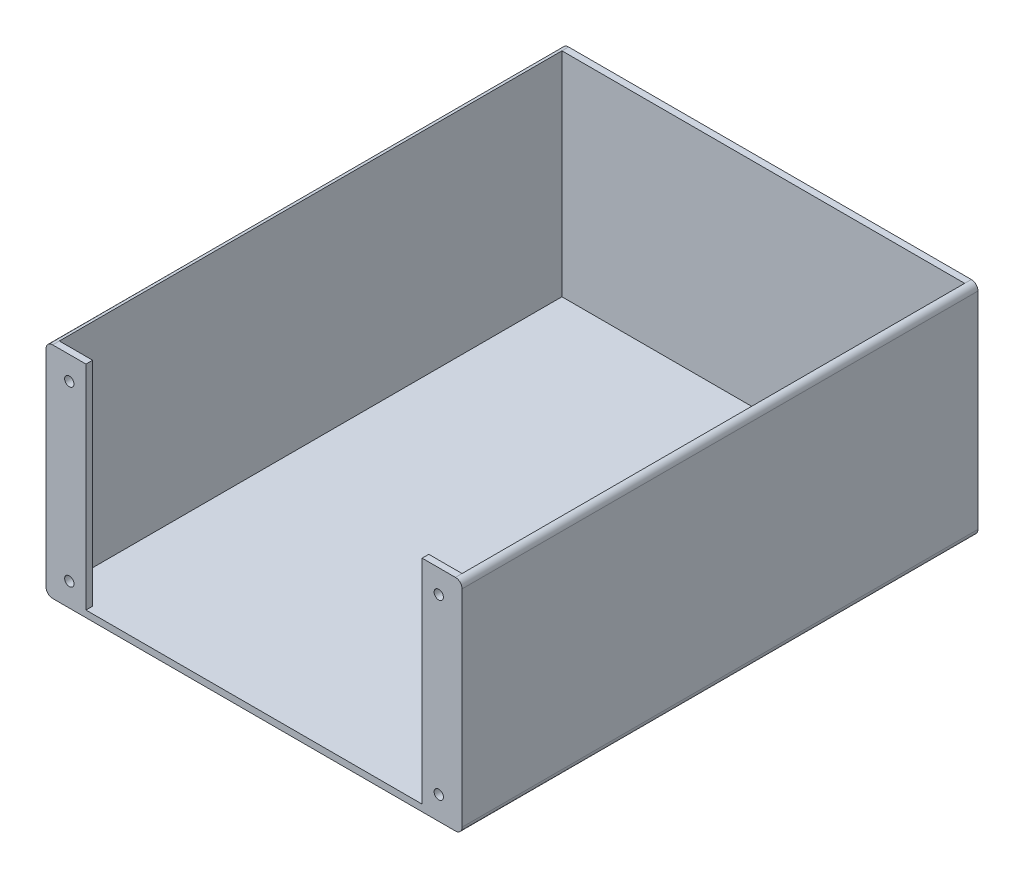
ISO-10303-21;
HEADER;
FILE_DESCRIPTION(('STEP AP214'),'2;1');
FILE_NAME('part.step','',(''),(''),'','','');
FILE_SCHEMA(('AUTOMOTIVE_DESIGN { 1 0 10303 214 1 1 1 1 }'));
ENDSEC;
DATA;
#1=APPLICATION_CONTEXT('core data for automotive mechanical design processes');
#2=APPLICATION_PROTOCOL_DEFINITION('international standard','automotive_design',2000,#1);
#3=PRODUCT_CONTEXT('',#1,'mechanical');
#4=PRODUCT('Part','Part','',(#3));
#5=PRODUCT_RELATED_PRODUCT_CATEGORY('part','',(#4));
#6=PRODUCT_DEFINITION_FORMATION('','',#4);
#7=PRODUCT_DEFINITION_CONTEXT('part definition',#1,'design');
#8=PRODUCT_DEFINITION('design','',#6,#7);
#9=PRODUCT_DEFINITION_SHAPE('','',#8);
#10=(LENGTH_UNIT() NAMED_UNIT(*) SI_UNIT(.MILLI.,.METRE.));
#11=(NAMED_UNIT(*) PLANE_ANGLE_UNIT() SI_UNIT($,.RADIAN.));
#12=(NAMED_UNIT(*) SI_UNIT($,.STERADIAN.) SOLID_ANGLE_UNIT());
#13=UNCERTAINTY_MEASURE_WITH_UNIT(LENGTH_MEASURE(1.E-05),#10,'distance_accuracy_value','');
#14=(GEOMETRIC_REPRESENTATION_CONTEXT(3) GLOBAL_UNCERTAINTY_ASSIGNED_CONTEXT((#13)) GLOBAL_UNIT_ASSIGNED_CONTEXT((#10,
#11,#12)) REPRESENTATION_CONTEXT('',''));
#15=CARTESIAN_POINT('',(0.,0.,0.));
#16=DIRECTION('',(0.,0.,1.));
#17=DIRECTION('',(1.,0.,0.));
#18=AXIS2_PLACEMENT_3D('',#15,#16,#17);
#19=CARTESIAN_POINT('',(-82.0163890560179,52.4090808351323,155.));
#20=DIRECTION('',(0.,-1.,0.));
#21=DIRECTION('',(0.,0.,-1.));
#22=AXIS2_PLACEMENT_3D('',#19,#20,#21);
#23=PLANE('',#22);
#24=DIRECTION('',(-1.,0.,0.));
#25=VECTOR('',#24,1.);
#26=CARTESIAN_POINT('',(-82.0163890560179,52.4090808351323,155.));
#27=LINE('',#26,#25);
#28=CARTESIAN_POINT('',(-70.0163890560179,52.4090808351323,155.));
#29=VERTEX_POINT('',#28);
#30=CARTESIAN_POINT('',(-80.0163890560179,52.4090808351323,155.));
#31=VERTEX_POINT('',#30);
#32=EDGE_CURVE('E289',#29,#31,#27,.T.);
#33=ORIENTED_EDGE('',*,*,#32,.F.);
#34=DIRECTION('',(0.,0.,-1.));
#35=VECTOR('',#34,1.);
#36=CARTESIAN_POINT('',(-70.0163890560179,52.4090808351323,155.));
#37=LINE('',#36,#35);
#38=CARTESIAN_POINT('',(-70.0163890560179,52.4090808351323,153.));
#39=VERTEX_POINT('',#38);
#40=EDGE_CURVE('E177',#29,#39,#37,.T.);
#41=ORIENTED_EDGE('',*,*,#40,.T.);
#42=DIRECTION('',(1.,0.,0.));
#43=VECTOR('',#42,1.);
#44=CARTESIAN_POINT('',(-80.0163890560179,52.4090808351323,153.));
#45=LINE('',#44,#43);
#46=CARTESIAN_POINT('',(-80.0163890560179,52.4090808351323,153.));
#47=VERTEX_POINT('',#46);
#48=EDGE_CURVE('E225',#47,#39,#45,.T.);
#49=ORIENTED_EDGE('',*,*,#48,.F.);
#50=DIRECTION('',(0.,0.,-1.));
#51=VECTOR('',#50,1.);
#52=CARTESIAN_POINT('',(-80.0163890560179,52.4090808351323,155.));
#53=LINE('',#52,#51);
#54=EDGE_CURVE('E345',#47,#31,#53,.F.);
#55=ORIENTED_EDGE('',*,*,#54,.T.);
#56=EDGE_LOOP('',(#33,#41,#49,#55));
#57=FACE_BOUND('',#56,.T.);
#58=ADVANCED_FACE('F47',(#57),#23,.F.);
#59=CARTESIAN_POINT('',(-80.0163890560179,-11.5909191648677,153.));
#60=DIRECTION('',(0.,0.,1.));
#61=DIRECTION('',(1.,0.,0.));
#62=AXIS2_PLACEMENT_3D('',#59,#60,#61);
#63=PLANE('',#62);
#64=CARTESIAN_POINT('',(-75.0163890560179,45.4090808351323,153.));
#65=DIRECTION('',(0.,0.,1.));
#66=DIRECTION('',(1.,0.,0.));
#67=AXIS2_PLACEMENT_3D('',#64,#65,#66);
#68=CIRCLE('',#67,1.4);
#69=CARTESIAN_POINT('',(-73.6163890560179,45.4090808351323,153.));
#70=VERTEX_POINT('',#69);
#71=EDGE_CURVE('E255',#70,#70,#68,.F.);
#72=ORIENTED_EDGE('',*,*,#71,.F.);
#73=EDGE_LOOP('',(#72));
#74=FACE_BOUND('',#73,.T.);
#75=CARTESIAN_POINT('',(-75.0163890560179,-6.59091916486775,153.));
#76=DIRECTION('',(0.,0.,1.));
#77=DIRECTION('',(1.,0.,0.));
#78=AXIS2_PLACEMENT_3D('',#75,#76,#77);
#79=CIRCLE('',#78,1.4);
#80=CARTESIAN_POINT('',(-73.6163890560179,-6.59091916486775,153.));
#81=VERTEX_POINT('',#80);
#82=EDGE_CURVE('E251',#81,#81,#79,.F.);
#83=ORIENTED_EDGE('',*,*,#82,.F.);
#84=EDGE_LOOP('',(#83));
#85=FACE_BOUND('',#84,.T.);
#86=ORIENTED_EDGE('',*,*,#48,.T.);
#87=DIRECTION('',(0.,-1.,0.));
#88=VECTOR('',#87,1.);
#89=CARTESIAN_POINT('',(-70.0163890560179,-11.5909191648677,153.));
#90=LINE('',#89,#88);
#91=CARTESIAN_POINT('',(-70.0163890560179,-11.5909191648677,153.));
#92=VERTEX_POINT('',#91);
#93=EDGE_CURVE('E200',#39,#92,#90,.T.);
#94=ORIENTED_EDGE('',*,*,#93,.T.);
#95=DIRECTION('',(1.,0.,0.));
#96=VECTOR('',#95,1.);
#97=CARTESIAN_POINT('',(-80.0163890560179,-11.5909191648677,153.));
#98=LINE('',#97,#96);
#99=CARTESIAN_POINT('',(-80.0163890560179,-11.5909191648677,153.));
#100=VERTEX_POINT('',#99);
#101=EDGE_CURVE('E167',#100,#92,#98,.T.);
#102=ORIENTED_EDGE('',*,*,#101,.F.);
#103=DIRECTION('',(0.,1.,0.));
#104=VECTOR('',#103,1.);
#105=CARTESIAN_POINT('',(-80.0163890560179,-11.5909191648677,153.));
#106=LINE('',#105,#104);
#107=EDGE_CURVE('E220',#100,#47,#106,.T.);
#108=ORIENTED_EDGE('',*,*,#107,.T.);
#109=EDGE_LOOP('',(#86,#94,#102,#108));
#110=FACE_BOUND('',#109,.T.);
#111=ADVANCED_FACE('F413',(#74,#85,#110),#63,.F.);
#112=CARTESIAN_POINT('',(-80.0163890560179,52.4090808351323,0.));
#113=VERTEX_POINT('',#112);
#114=CARTESIAN_POINT('',(-80.0163890560179,52.4090808351323,2.));
#115=VERTEX_POINT('',#114);
#116=EDGE_CURVE('E346',#113,#115,#53,.F.);
#117=ORIENTED_EDGE('',*,*,#116,.T.);
#118=DIRECTION('',(-1.,0.,0.));
#119=VECTOR('',#118,1.);
#120=CARTESIAN_POINT('',(-80.0163890560179,52.4090808351323,2.));
#121=LINE('',#120,#119);
#122=CARTESIAN_POINT('',(40.9836109439821,52.4090808351323,2.));
#123=VERTEX_POINT('',#122);
#124=EDGE_CURVE('E72',#123,#115,#121,.T.);
#125=ORIENTED_EDGE('',*,*,#124,.F.);
#126=DIRECTION('',(0.,0.,-1.));
#127=VECTOR('',#126,1.);
#128=CARTESIAN_POINT('',(40.9836109439821,52.4090808351323,155.));
#129=LINE('',#128,#127);
#130=CARTESIAN_POINT('',(40.9836109439821,52.4090808351323,0.));
#131=VERTEX_POINT('',#130);
#132=EDGE_CURVE('E350',#123,#131,#129,.T.);
#133=ORIENTED_EDGE('',*,*,#132,.T.);
#134=DIRECTION('',(-1.,0.,0.));
#135=VECTOR('',#134,1.);
#136=CARTESIAN_POINT('',(-82.0163890560179,52.4090808351323,0.));
#137=LINE('',#136,#135);
#138=EDGE_CURVE('E281',#131,#113,#137,.T.);
#139=ORIENTED_EDGE('',*,*,#138,.T.);
#140=EDGE_LOOP('',(#117,#125,#133,#139));
#141=FACE_BOUND('',#140,.T.);
#142=ADVANCED_FACE('F402',(#141),#23,.F.);
#143=CARTESIAN_POINT('',(-82.0163890560179,52.4090808351323,155.));
#144=DIRECTION('',(1.,0.,0.));
#145=DIRECTION('',(0.,1.,0.));
#146=AXIS2_PLACEMENT_3D('',#143,#144,#145);
#147=PLANE('',#146);
#148=DIRECTION('',(0.,-1.,0.));
#149=VECTOR('',#148,1.);
#150=CARTESIAN_POINT('',(-82.0163890560179,52.4090808351323,0.));
#151=LINE('',#150,#149);
#152=CARTESIAN_POINT('',(-82.0163890560179,50.4090808351323,0.));
#153=VERTEX_POINT('',#152);
#154=CARTESIAN_POINT('',(-82.0163890560179,-11.5909191648677,0.));
#155=VERTEX_POINT('',#154);
#156=EDGE_CURVE('E275',#153,#155,#151,.T.);
#157=ORIENTED_EDGE('',*,*,#156,.T.);
#158=DIRECTION('',(0.,0.,-1.));
#159=VECTOR('',#158,1.);
#160=CARTESIAN_POINT('',(-82.0163890560179,-11.5909191648677,155.));
#161=LINE('',#160,#159);
#162=CARTESIAN_POINT('',(-82.0163890560179,-11.5909191648677,155.));
#163=VERTEX_POINT('',#162);
#164=EDGE_CURVE('E11',#155,#163,#161,.F.);
#165=ORIENTED_EDGE('',*,*,#164,.T.);
#166=DIRECTION('',(0.,-1.,0.));
#167=VECTOR('',#166,1.);
#168=CARTESIAN_POINT('',(-82.0163890560179,52.4090808351323,155.));
#169=LINE('',#168,#167);
#170=CARTESIAN_POINT('',(-82.0163890560179,50.4090808351323,155.));
#171=VERTEX_POINT('',#170);
#172=EDGE_CURVE('E276',#171,#163,#169,.T.);
#173=ORIENTED_EDGE('',*,*,#172,.F.);
#174=DIRECTION('',(0.,0.,-1.));
#175=VECTOR('',#174,1.);
#176=CARTESIAN_POINT('',(-82.0163890560179,50.4090808351323,155.));
#177=LINE('',#176,#175);
#178=EDGE_CURVE('E57',#171,#153,#177,.T.);
#179=ORIENTED_EDGE('',*,*,#178,.T.);
#180=EDGE_LOOP('',(#157,#165,#173,#179));
#181=FACE_BOUND('',#180,.T.);
#182=ADVANCED_FACE('F361',(#181),#147,.F.);
#183=CARTESIAN_POINT('',(-82.0163890560179,-13.5909191648677,155.));
#184=DIRECTION('',(0.,1.,0.));
#185=DIRECTION('',(0.,0.,1.));
#186=AXIS2_PLACEMENT_3D('',#183,#184,#185);
#187=PLANE('',#186);
#188=DIRECTION('',(1.,0.,0.));
#189=VECTOR('',#188,1.);
#190=CARTESIAN_POINT('',(-82.0163890560179,-13.5909191648677,0.));
#191=LINE('',#190,#189);
#192=CARTESIAN_POINT('',(-80.0163890560179,-13.5909191648677,0.));
#193=VERTEX_POINT('',#192);
#194=CARTESIAN_POINT('',(40.9836109439821,-13.5909191648677,0.));
#195=VERTEX_POINT('',#194);
#196=EDGE_CURVE('E297',#193,#195,#191,.T.);
#197=ORIENTED_EDGE('',*,*,#196,.T.);
#198=DIRECTION('',(0.,0.,-1.));
#199=VECTOR('',#198,1.);
#200=CARTESIAN_POINT('',(40.9836109439821,-13.5909191648677,155.));
#201=LINE('',#200,#199);
#202=CARTESIAN_POINT('',(40.9836109439821,-13.5909191648677,155.));
#203=VERTEX_POINT('',#202);
#204=EDGE_CURVE('E330',#195,#203,#201,.F.);
#205=ORIENTED_EDGE('',*,*,#204,.T.);
#206=DIRECTION('',(1.,0.,0.));
#207=VECTOR('',#206,1.);
#208=CARTESIAN_POINT('',(-82.0163890560179,-13.5909191648677,155.));
#209=LINE('',#208,#207);
#210=CARTESIAN_POINT('',(-80.0163890560179,-13.5909191648677,155.));
#211=VERTEX_POINT('',#210);
#212=EDGE_CURVE('E280',#211,#203,#209,.T.);
#213=ORIENTED_EDGE('',*,*,#212,.F.);
#214=DIRECTION('',(0.,0.,-1.));
#215=VECTOR('',#214,1.);
#216=CARTESIAN_POINT('',(-80.0163890560179,-13.5909191648677,155.));
#217=LINE('',#216,#215);
#218=EDGE_CURVE('E326',#211,#193,#217,.T.);
#219=ORIENTED_EDGE('',*,*,#218,.T.);
#220=EDGE_LOOP('',(#197,#205,#213,#219));
#221=FACE_BOUND('',#220,.T.);
#222=ADVANCED_FACE('F376',(#221),#187,.F.);
#223=CARTESIAN_POINT('',(42.9836109439821,52.4090808351323,155.));
#224=DIRECTION('',(-1.,0.,0.));
#225=DIRECTION('',(0.,-1.,0.));
#226=AXIS2_PLACEMENT_3D('',#223,#224,#225);
#227=PLANE('',#226);
#228=DIRECTION('',(0.,1.,0.));
#229=VECTOR('',#228,1.);
#230=CARTESIAN_POINT('',(42.9836109439821,52.4090808351323,155.));
#231=LINE('',#230,#229);
#232=CARTESIAN_POINT('',(42.9836109439821,-11.5909191648677,155.));
#233=VERTEX_POINT('',#232);
#234=CARTESIAN_POINT('',(42.9836109439821,50.4090808351323,155.));
#235=VERTEX_POINT('',#234);
#236=EDGE_CURVE('E285',#233,#235,#231,.T.);
#237=ORIENTED_EDGE('',*,*,#236,.F.);
#238=DIRECTION('',(0.,0.,-1.));
#239=VECTOR('',#238,1.);
#240=CARTESIAN_POINT('',(42.9836109439821,-11.5909191648677,155.));
#241=LINE('',#240,#239);
#242=CARTESIAN_POINT('',(42.9836109439821,-11.5909191648677,0.));
#243=VERTEX_POINT('',#242);
#244=EDGE_CURVE('E310',#233,#243,#241,.T.);
#245=ORIENTED_EDGE('',*,*,#244,.T.);
#246=DIRECTION('',(0.,1.,0.));
#247=VECTOR('',#246,1.);
#248=CARTESIAN_POINT('',(42.9836109439821,52.4090808351323,0.));
#249=LINE('',#248,#247);
#250=CARTESIAN_POINT('',(42.9836109439821,50.4090808351323,0.));
#251=VERTEX_POINT('',#250);
#252=EDGE_CURVE('E301',#243,#251,#249,.T.);
#253=ORIENTED_EDGE('',*,*,#252,.T.);
#254=DIRECTION('',(0.,0.,-1.));
#255=VECTOR('',#254,1.);
#256=CARTESIAN_POINT('',(42.9836109439821,50.4090808351323,155.));
#257=LINE('',#256,#255);
#258=EDGE_CURVE('E293',#251,#235,#257,.F.);
#259=ORIENTED_EDGE('',*,*,#258,.T.);
#260=EDGE_LOOP('',(#237,#245,#253,#259));
#261=FACE_BOUND('',#260,.T.);
#262=ADVANCED_FACE('F384',(#261),#227,.F.);
#263=CARTESIAN_POINT('',(30.9836109439821,52.4090808351323,153.));
#264=VERTEX_POINT('',#263);
#265=CARTESIAN_POINT('',(40.9836109439821,52.4090808351323,153.));
#266=VERTEX_POINT('',#265);
#267=EDGE_CURVE('E224',#264,#266,#45,.T.);
#268=ORIENTED_EDGE('',*,*,#267,.F.);
#269=DIRECTION('',(0.,0.,1.));
#270=VECTOR('',#269,1.);
#271=CARTESIAN_POINT('',(30.9836109439821,52.4090808351323,155.));
#272=LINE('',#271,#270);
#273=CARTESIAN_POINT('',(30.9836109439821,52.4090808351323,155.));
#274=VERTEX_POINT('',#273);
#275=EDGE_CURVE('E196',#264,#274,#272,.T.);
#276=ORIENTED_EDGE('',*,*,#275,.T.);
#277=CARTESIAN_POINT('',(40.9836109439821,52.4090808351323,155.));
#278=VERTEX_POINT('',#277);
#279=EDGE_CURVE('E290',#278,#274,#27,.T.);
#280=ORIENTED_EDGE('',*,*,#279,.F.);
#281=EDGE_CURVE('E351',#278,#266,#129,.T.);
#282=ORIENTED_EDGE('',*,*,#281,.T.);
#283=EDGE_LOOP('',(#268,#276,#280,#282));
#284=FACE_BOUND('',#283,.T.);
#285=ADVANCED_FACE('F396',(#284),#23,.F.);
#286=CARTESIAN_POINT('',(0.,0.,155.));
#287=DIRECTION('',(0.,0.,1.));
#288=DIRECTION('',(1.,0.,0.));
#289=AXIS2_PLACEMENT_3D('',#286,#287,#288);
#290=PLANE('',#289);
#291=DIRECTION('',(0.,-1.,0.));
#292=VECTOR('',#291,1.);
#293=CARTESIAN_POINT('',(-70.0163890560179,52.4404586301676,155.));
#294=LINE('',#293,#292);
#295=CARTESIAN_POINT('',(-70.0163890560179,-11.5909191648677,155.));
#296=VERTEX_POINT('',#295);
#297=EDGE_CURVE('E174',#29,#296,#294,.T.);
#298=ORIENTED_EDGE('',*,*,#297,.F.);
#299=ORIENTED_EDGE('',*,*,#32,.T.);
#300=CARTESIAN_POINT('',(-80.0163890560179,50.4090808351323,155.));
#301=DIRECTION('',(0.,0.,1.));
#302=DIRECTION('',(1.,0.,0.));
#303=AXIS2_PLACEMENT_3D('',#300,#301,#302);
#304=CIRCLE('',#303,2.);
#305=EDGE_CURVE('E333',#31,#171,#304,.T.);
#306=ORIENTED_EDGE('',*,*,#305,.T.);
#307=ORIENTED_EDGE('',*,*,#172,.T.);
#308=CARTESIAN_POINT('',(-80.0163890560179,-11.5909191648677,155.));
#309=DIRECTION('',(0.,0.,1.));
#310=DIRECTION('',(1.,0.,0.));
#311=AXIS2_PLACEMENT_3D('',#308,#309,#310);
#312=CIRCLE('',#311,2.);
#313=EDGE_CURVE('E336',#163,#211,#312,.T.);
#314=ORIENTED_EDGE('',*,*,#313,.T.);
#315=ORIENTED_EDGE('',*,*,#212,.T.);
#316=CARTESIAN_POINT('',(40.9836109439821,-11.5909191648677,155.));
#317=DIRECTION('',(0.,0.,1.));
#318=DIRECTION('',(1.,0.,0.));
#319=AXIS2_PLACEMENT_3D('',#316,#317,#318);
#320=CIRCLE('',#319,2.);
#321=EDGE_CURVE('E342',#203,#233,#320,.T.);
#322=ORIENTED_EDGE('',*,*,#321,.T.);
#323=ORIENTED_EDGE('',*,*,#236,.T.);
#324=CARTESIAN_POINT('',(40.9836109439821,50.4090808351323,155.));
#325=DIRECTION('',(0.,0.,1.));
#326=DIRECTION('',(1.,0.,0.));
#327=AXIS2_PLACEMENT_3D('',#324,#325,#326);
#328=CIRCLE('',#327,2.);
#329=EDGE_CURVE('E339',#235,#278,#328,.T.);
#330=ORIENTED_EDGE('',*,*,#329,.T.);
#331=ORIENTED_EDGE('',*,*,#279,.T.);
#332=DIRECTION('',(0.,1.,0.));
#333=VECTOR('',#332,1.);
#334=CARTESIAN_POINT('',(30.9836109439821,52.4404586301676,155.));
#335=LINE('',#334,#333);
#336=CARTESIAN_POINT('',(30.9836109439821,-11.5909191648677,155.));
#337=VERTEX_POINT('',#336);
#338=EDGE_CURVE('E171',#337,#274,#335,.T.);
#339=ORIENTED_EDGE('',*,*,#338,.F.);
#340=DIRECTION('',(1.,0.,0.));
#341=VECTOR('',#340,1.);
#342=CARTESIAN_POINT('',(-70.0163890560179,-11.5909191648677,155.));
#343=LINE('',#342,#341);
#344=EDGE_CURVE('E163',#296,#337,#343,.T.);
#345=ORIENTED_EDGE('',*,*,#344,.F.);
#346=EDGE_LOOP('',(#298,#299,#306,#307,#314,#315,#322,#323,#330,#331,#339,#345));
#347=FACE_BOUND('',#346,.T.);
#348=CARTESIAN_POINT('',(35.9836109439821,45.4090808351323,155.));
#349=DIRECTION('',(0.,0.,1.));
#350=DIRECTION('',(1.,0.,0.));
#351=AXIS2_PLACEMENT_3D('',#348,#349,#350);
#352=CIRCLE('',#351,1.4);
#353=CARTESIAN_POINT('',(37.3836109439821,45.4090808351323,155.));
#354=VERTEX_POINT('',#353);
#355=EDGE_CURVE('E259',#354,#354,#352,.T.);
#356=ORIENTED_EDGE('',*,*,#355,.F.);
#357=EDGE_LOOP('',(#356));
#358=FACE_BOUND('',#357,.T.);
#359=CARTESIAN_POINT('',(35.9836109439821,-6.59091916486775,155.));
#360=DIRECTION('',(0.,0.,1.));
#361=DIRECTION('',(1.,0.,0.));
#362=AXIS2_PLACEMENT_3D('',#359,#360,#361);
#363=CIRCLE('',#362,1.4);
#364=CARTESIAN_POINT('',(37.3836109439821,-6.59091916486775,155.));
#365=VERTEX_POINT('',#364);
#366=EDGE_CURVE('E265',#365,#365,#363,.T.);
#367=ORIENTED_EDGE('',*,*,#366,.F.);
#368=EDGE_LOOP('',(#367));
#369=FACE_BOUND('',#368,.T.);
#370=CARTESIAN_POINT('',(-75.0163890560179,-6.59091916486775,155.));
#371=DIRECTION('',(0.,0.,1.));
#372=DIRECTION('',(1.,0.,0.));
#373=AXIS2_PLACEMENT_3D('',#370,#371,#372);
#374=CIRCLE('',#373,1.4);
#375=CARTESIAN_POINT('',(-73.6163890560179,-6.59091916486775,155.));
#376=VERTEX_POINT('',#375);
#377=EDGE_CURVE('E260',#376,#376,#374,.T.);
#378=ORIENTED_EDGE('',*,*,#377,.F.);
#379=EDGE_LOOP('',(#378));
#380=FACE_BOUND('',#379,.T.);
#381=CARTESIAN_POINT('',(-75.0163890560179,45.4090808351323,155.));
#382=DIRECTION('',(0.,0.,1.));
#383=DIRECTION('',(1.,0.,0.));
#384=AXIS2_PLACEMENT_3D('',#381,#382,#383);
#385=CIRCLE('',#384,1.4);
#386=CARTESIAN_POINT('',(-73.6163890560179,45.4090808351323,155.));
#387=VERTEX_POINT('',#386);
#388=EDGE_CURVE('E264',#387,#387,#385,.T.);
#389=ORIENTED_EDGE('',*,*,#388,.F.);
#390=EDGE_LOOP('',(#389));
#391=FACE_BOUND('',#390,.T.);
#392=ADVANCED_FACE('F182',(#347,#358,#369,#380,#391),#290,.T.);
#393=CARTESIAN_POINT('',(0.,0.,0.));
#394=DIRECTION('',(0.,0.,1.));
#395=DIRECTION('',(1.,0.,0.));
#396=AXIS2_PLACEMENT_3D('',#393,#394,#395);
#397=PLANE('',#396);
#398=ORIENTED_EDGE('',*,*,#252,.F.);
#399=CARTESIAN_POINT('',(40.9836109439821,-11.5909191648677,0.));
#400=DIRECTION('',(0.,0.,1.));
#401=DIRECTION('',(1.,0.,0.));
#402=AXIS2_PLACEMENT_3D('',#399,#400,#401);
#403=CIRCLE('',#402,2.);
#404=EDGE_CURVE('E323',#243,#195,#403,.F.);
#405=ORIENTED_EDGE('',*,*,#404,.T.);
#406=ORIENTED_EDGE('',*,*,#196,.F.);
#407=CARTESIAN_POINT('',(-80.0163890560179,-11.5909191648677,0.));
#408=DIRECTION('',(0.,0.,1.));
#409=DIRECTION('',(1.,0.,0.));
#410=AXIS2_PLACEMENT_3D('',#407,#408,#409);
#411=CIRCLE('',#410,2.);
#412=EDGE_CURVE('E317',#193,#155,#411,.F.);
#413=ORIENTED_EDGE('',*,*,#412,.T.);
#414=ORIENTED_EDGE('',*,*,#156,.F.);
#415=CARTESIAN_POINT('',(-80.0163890560179,50.4090808351323,0.));
#416=DIRECTION('',(0.,0.,1.));
#417=DIRECTION('',(1.,0.,0.));
#418=AXIS2_PLACEMENT_3D('',#415,#416,#417);
#419=CIRCLE('',#418,2.);
#420=EDGE_CURVE('E314',#153,#113,#419,.F.);
#421=ORIENTED_EDGE('',*,*,#420,.T.);
#422=ORIENTED_EDGE('',*,*,#138,.F.);
#423=CARTESIAN_POINT('',(40.9836109439821,50.4090808351323,0.));
#424=DIRECTION('',(0.,0.,1.));
#425=DIRECTION('',(1.,0.,0.));
#426=AXIS2_PLACEMENT_3D('',#423,#424,#425);
#427=CIRCLE('',#426,2.);
#428=EDGE_CURVE('E320',#131,#251,#427,.F.);
#429=ORIENTED_EDGE('',*,*,#428,.T.);
#430=EDGE_LOOP('',(#398,#405,#406,#413,#414,#421,#422,#429));
#431=FACE_BOUND('',#430,.T.);
#432=ADVANCED_FACE('F367',(#431),#397,.F.);
#433=CARTESIAN_POINT('',(40.9836109439821,-11.5909191648677,155.));
#434=DIRECTION('',(0.,0.,-1.));
#435=DIRECTION('',(-1.,0.,0.));
#436=AXIS2_PLACEMENT_3D('',#433,#434,#435);
#437=CYLINDRICAL_SURFACE('',#436,2.);
#438=ORIENTED_EDGE('',*,*,#321,.F.);
#439=ORIENTED_EDGE('',*,*,#204,.F.);
#440=ORIENTED_EDGE('',*,*,#404,.F.);
#441=ORIENTED_EDGE('',*,*,#244,.F.);
#442=EDGE_LOOP('',(#438,#439,#440,#441));
#443=FACE_BOUND('',#442,.T.);
#444=ADVANCED_FACE('F382',(#443),#437,.T.);
#445=CARTESIAN_POINT('',(40.9836109439821,50.4090808351323,155.));
#446=DIRECTION('',(0.,0.,-1.));
#447=DIRECTION('',(-1.,0.,0.));
#448=AXIS2_PLACEMENT_3D('',#445,#446,#447);
#449=CYLINDRICAL_SURFACE('',#448,2.);
#450=ORIENTED_EDGE('',*,*,#329,.F.);
#451=ORIENTED_EDGE('',*,*,#258,.F.);
#452=ORIENTED_EDGE('',*,*,#428,.F.);
#453=ORIENTED_EDGE('',*,*,#132,.F.);
#454=DIRECTION('',(0.,0.,-1.));
#455=VECTOR('',#454,1.);
#456=CARTESIAN_POINT('',(40.9836109439821,52.4090808351323,2.));
#457=LINE('',#456,#455);
#458=EDGE_CURVE('E229',#266,#123,#457,.T.);
#459=ORIENTED_EDGE('',*,*,#458,.F.);
#460=ORIENTED_EDGE('',*,*,#281,.F.);
#461=EDGE_LOOP('',(#450,#451,#452,#453,#459,#460));
#462=FACE_BOUND('',#461,.T.);
#463=ADVANCED_FACE('F390',(#462),#449,.T.);
#464=CARTESIAN_POINT('',(-80.0163890560179,-11.5909191648677,155.));
#465=DIRECTION('',(0.,0.,-1.));
#466=DIRECTION('',(-1.,0.,0.));
#467=AXIS2_PLACEMENT_3D('',#464,#465,#466);
#468=CYLINDRICAL_SURFACE('',#467,2.);
#469=ORIENTED_EDGE('',*,*,#313,.F.);
#470=ORIENTED_EDGE('',*,*,#164,.F.);
#471=ORIENTED_EDGE('',*,*,#412,.F.);
#472=ORIENTED_EDGE('',*,*,#218,.F.);
#473=EDGE_LOOP('',(#469,#470,#471,#472));
#474=FACE_BOUND('',#473,.T.);
#475=ADVANCED_FACE('F373',(#474),#468,.T.);
#476=CARTESIAN_POINT('',(-80.0163890560179,50.4090808351323,155.));
#477=DIRECTION('',(0.,0.,-1.));
#478=DIRECTION('',(-1.,0.,0.));
#479=AXIS2_PLACEMENT_3D('',#476,#477,#478);
#480=CYLINDRICAL_SURFACE('',#479,2.);
#481=ORIENTED_EDGE('',*,*,#305,.F.);
#482=ORIENTED_EDGE('',*,*,#54,.F.);
#483=DIRECTION('',(0.,0.,1.));
#484=VECTOR('',#483,1.);
#485=CARTESIAN_POINT('',(-80.0163890560179,52.4090808351323,2.));
#486=LINE('',#485,#484);
#487=EDGE_CURVE('E205',#115,#47,#486,.T.);
#488=ORIENTED_EDGE('',*,*,#487,.F.);
#489=ORIENTED_EDGE('',*,*,#116,.F.);
#490=ORIENTED_EDGE('',*,*,#420,.F.);
#491=ORIENTED_EDGE('',*,*,#178,.F.);
#492=EDGE_LOOP('',(#481,#482,#488,#489,#490,#491));
#493=FACE_BOUND('',#492,.T.);
#494=ADVANCED_FACE('F49',(#493),#480,.T.);
#495=CARTESIAN_POINT('',(-75.0163890560179,45.4090808351323,140.));
#496=DIRECTION('',(0.,0.,1.));
#497=DIRECTION('',(1.,0.,0.));
#498=AXIS2_PLACEMENT_3D('',#495,#496,#497);
#499=CYLINDRICAL_SURFACE('',#498,1.4);
#500=ORIENTED_EDGE('',*,*,#71,.T.);
#501=EDGE_LOOP('',(#500));
#502=FACE_BOUND('',#501,.T.);
#503=ORIENTED_EDGE('',*,*,#388,.T.);
#504=EDGE_LOOP('',(#503));
#505=FACE_BOUND('',#504,.T.);
#506=ADVANCED_FACE('F457',(#502,#505),#499,.F.);
#507=CARTESIAN_POINT('',(-75.0163890560179,-6.59091916486775,140.));
#508=DIRECTION('',(0.,0.,1.));
#509=DIRECTION('',(1.,0.,0.));
#510=AXIS2_PLACEMENT_3D('',#507,#508,#509);
#511=CYLINDRICAL_SURFACE('',#510,1.4);
#512=ORIENTED_EDGE('',*,*,#82,.T.);
#513=EDGE_LOOP('',(#512));
#514=FACE_BOUND('',#513,.T.);
#515=ORIENTED_EDGE('',*,*,#377,.T.);
#516=EDGE_LOOP('',(#515));
#517=FACE_BOUND('',#516,.T.);
#518=ADVANCED_FACE('F461',(#514,#517),#511,.F.);
#519=CARTESIAN_POINT('',(35.9836109439821,-6.59091916486775,140.));
#520=DIRECTION('',(0.,0.,1.));
#521=DIRECTION('',(1.,0.,0.));
#522=AXIS2_PLACEMENT_3D('',#519,#520,#521);
#523=CYLINDRICAL_SURFACE('',#522,1.4);
#524=CARTESIAN_POINT('',(35.9836109439821,-6.59091916486775,153.));
#525=DIRECTION('',(0.,0.,1.));
#526=DIRECTION('',(1.,0.,0.));
#527=AXIS2_PLACEMENT_3D('',#524,#525,#526);
#528=CIRCLE('',#527,1.4);
#529=CARTESIAN_POINT('',(37.3836109439821,-6.59091916486775,153.));
#530=VERTEX_POINT('',#529);
#531=EDGE_CURVE('E247',#530,#530,#528,.F.);
#532=ORIENTED_EDGE('',*,*,#531,.T.);
#533=EDGE_LOOP('',(#532));
#534=FACE_BOUND('',#533,.T.);
#535=ORIENTED_EDGE('',*,*,#366,.T.);
#536=EDGE_LOOP('',(#535));
#537=FACE_BOUND('',#536,.T.);
#538=ADVANCED_FACE('F467',(#534,#537),#523,.F.);
#539=CARTESIAN_POINT('',(35.9836109439821,45.4090808351323,140.));
#540=DIRECTION('',(0.,0.,1.));
#541=DIRECTION('',(1.,0.,0.));
#542=AXIS2_PLACEMENT_3D('',#539,#540,#541);
#543=CYLINDRICAL_SURFACE('',#542,1.4);
#544=CARTESIAN_POINT('',(35.9836109439821,45.4090808351323,153.));
#545=DIRECTION('',(0.,0.,1.));
#546=DIRECTION('',(1.,0.,0.));
#547=AXIS2_PLACEMENT_3D('',#544,#545,#546);
#548=CIRCLE('',#547,1.4);
#549=CARTESIAN_POINT('',(37.3836109439821,45.4090808351323,153.));
#550=VERTEX_POINT('',#549);
#551=EDGE_CURVE('E51',#550,#550,#548,.F.);
#552=ORIENTED_EDGE('',*,*,#551,.T.);
#553=EDGE_LOOP('',(#552));
#554=FACE_BOUND('',#553,.T.);
#555=ORIENTED_EDGE('',*,*,#355,.T.);
#556=EDGE_LOOP('',(#555));
#557=FACE_BOUND('',#556,.T.);
#558=ADVANCED_FACE('F472',(#554,#557),#543,.F.);
#559=ORIENTED_EDGE('',*,*,#551,.F.);
#560=EDGE_LOOP('',(#559));
#561=FACE_BOUND('',#560,.T.);
#562=CARTESIAN_POINT('',(30.9836109439821,-11.5909191648677,153.));
#563=VERTEX_POINT('',#562);
#564=CARTESIAN_POINT('',(40.9836109439821,-11.5909191648677,153.));
#565=VERTEX_POINT('',#564);
#566=EDGE_CURVE('E209',#563,#565,#98,.T.);
#567=ORIENTED_EDGE('',*,*,#566,.F.);
#568=DIRECTION('',(0.,1.,0.));
#569=VECTOR('',#568,1.);
#570=CARTESIAN_POINT('',(30.9836109439821,-11.5909191648677,153.));
#571=LINE('',#570,#569);
#572=EDGE_CURVE('E191',#563,#264,#571,.T.);
#573=ORIENTED_EDGE('',*,*,#572,.T.);
#574=ORIENTED_EDGE('',*,*,#267,.T.);
#575=DIRECTION('',(0.,1.,0.));
#576=VECTOR('',#575,1.);
#577=CARTESIAN_POINT('',(40.9836109439821,-11.5909191648677,153.));
#578=LINE('',#577,#576);
#579=EDGE_CURVE('E241',#565,#266,#578,.T.);
#580=ORIENTED_EDGE('',*,*,#579,.F.);
#581=EDGE_LOOP('',(#567,#573,#574,#580));
#582=FACE_BOUND('',#581,.T.);
#583=ORIENTED_EDGE('',*,*,#531,.F.);
#584=EDGE_LOOP('',(#583));
#585=FACE_BOUND('',#584,.T.);
#586=ADVANCED_FACE('F423',(#561,#582,#585),#63,.F.);
#587=CARTESIAN_POINT('',(-80.0163890560179,-11.5909191648677,2.));
#588=DIRECTION('',(-1.,0.,0.));
#589=DIRECTION('',(0.,0.,1.));
#590=AXIS2_PLACEMENT_3D('',#587,#588,#589);
#591=PLANE('',#590);
#592=ORIENTED_EDGE('',*,*,#487,.T.);
#593=ORIENTED_EDGE('',*,*,#107,.F.);
#594=DIRECTION('',(0.,0.,1.));
#595=VECTOR('',#594,1.);
#596=CARTESIAN_POINT('',(-80.0163890560179,-11.5909191648677,2.));
#597=LINE('',#596,#595);
#598=CARTESIAN_POINT('',(-80.0163890560179,-11.5909191648677,2.));
#599=VERTEX_POINT('',#598);
#600=EDGE_CURVE('E206',#599,#100,#597,.T.);
#601=ORIENTED_EDGE('',*,*,#600,.F.);
#602=DIRECTION('',(0.,1.,0.));
#603=VECTOR('',#602,1.);
#604=CARTESIAN_POINT('',(-80.0163890560179,-11.5909191648677,2.));
#605=LINE('',#604,#603);
#606=EDGE_CURVE('E235',#599,#115,#605,.T.);
#607=ORIENTED_EDGE('',*,*,#606,.T.);
#608=EDGE_LOOP('',(#592,#593,#601,#607));
#609=FACE_BOUND('',#608,.T.);
#610=ADVANCED_FACE('F409',(#609),#591,.F.);
#611=CARTESIAN_POINT('',(-80.0163890560179,-11.5909191648677,2.));
#612=DIRECTION('',(0.,0.,-1.));
#613=DIRECTION('',(-1.,0.,0.));
#614=AXIS2_PLACEMENT_3D('',#611,#612,#613);
#615=PLANE('',#614);
#616=ORIENTED_EDGE('',*,*,#124,.T.);
#617=ORIENTED_EDGE('',*,*,#606,.F.);
#618=DIRECTION('',(-1.,0.,0.));
#619=VECTOR('',#618,1.);
#620=CARTESIAN_POINT('',(-80.0163890560179,-11.5909191648677,2.));
#621=LINE('',#620,#619);
#622=CARTESIAN_POINT('',(40.9836109439821,-11.5909191648677,2.));
#623=VERTEX_POINT('',#622);
#624=EDGE_CURVE('E216',#623,#599,#621,.T.);
#625=ORIENTED_EDGE('',*,*,#624,.F.);
#626=DIRECTION('',(0.,1.,0.));
#627=VECTOR('',#626,1.);
#628=CARTESIAN_POINT('',(40.9836109439821,-11.5909191648677,2.));
#629=LINE('',#628,#627);
#630=EDGE_CURVE('E238',#623,#123,#629,.T.);
#631=ORIENTED_EDGE('',*,*,#630,.T.);
#632=EDGE_LOOP('',(#616,#617,#625,#631));
#633=FACE_BOUND('',#632,.T.);
#634=ADVANCED_FACE('F415',(#633),#615,.F.);
#635=CARTESIAN_POINT('',(40.9836109439821,-11.5909191648677,2.));
#636=DIRECTION('',(1.,0.,0.));
#637=DIRECTION('',(0.,0.,-1.));
#638=AXIS2_PLACEMENT_3D('',#635,#636,#637);
#639=PLANE('',#638);
#640=ORIENTED_EDGE('',*,*,#458,.T.);
#641=ORIENTED_EDGE('',*,*,#630,.F.);
#642=DIRECTION('',(0.,0.,-1.));
#643=VECTOR('',#642,1.);
#644=CARTESIAN_POINT('',(40.9836109439821,-11.5909191648677,2.));
#645=LINE('',#644,#643);
#646=EDGE_CURVE('E212',#565,#623,#645,.T.);
#647=ORIENTED_EDGE('',*,*,#646,.F.);
#648=ORIENTED_EDGE('',*,*,#579,.T.);
#649=EDGE_LOOP('',(#640,#641,#647,#648));
#650=FACE_BOUND('',#649,.T.);
#651=ADVANCED_FACE('F398',(#650),#639,.F.);
#652=CARTESIAN_POINT('',(0.,-11.5909191648677,0.));
#653=DIRECTION('',(0.,1.,0.));
#654=DIRECTION('',(0.,0.,1.));
#655=AXIS2_PLACEMENT_3D('',#652,#653,#654);
#656=PLANE('',#655);
#657=ORIENTED_EDGE('',*,*,#101,.T.);
#658=DIRECTION('',(0.,0.,1.));
#659=VECTOR('',#658,1.);
#660=CARTESIAN_POINT('',(-70.0163890560179,-11.5909191648677,91.));
#661=LINE('',#660,#659);
#662=EDGE_CURVE('E159',#92,#296,#661,.T.);
#663=ORIENTED_EDGE('',*,*,#662,.T.);
#664=ORIENTED_EDGE('',*,*,#344,.T.);
#665=DIRECTION('',(0.,0.,1.));
#666=VECTOR('',#665,1.);
#667=CARTESIAN_POINT('',(30.9836109439821,-11.5909191648677,91.));
#668=LINE('',#667,#666);
#669=EDGE_CURVE('E64',#563,#337,#668,.T.);
#670=ORIENTED_EDGE('',*,*,#669,.F.);
#671=ORIENTED_EDGE('',*,*,#566,.T.);
#672=ORIENTED_EDGE('',*,*,#646,.T.);
#673=ORIENTED_EDGE('',*,*,#624,.T.);
#674=ORIENTED_EDGE('',*,*,#600,.T.);
#675=EDGE_LOOP('',(#657,#663,#664,#670,#671,#672,#673,#674));
#676=FACE_BOUND('',#675,.T.);
#677=ADVANCED_FACE('F161',(#676),#656,.T.);
#678=CARTESIAN_POINT('',(-70.0163890560179,52.4404586301676,91.));
#679=DIRECTION('',(-1.,0.,0.));
#680=DIRECTION('',(0.,0.,1.));
#681=AXIS2_PLACEMENT_3D('',#678,#679,#680);
#682=PLANE('',#681);
#683=ORIENTED_EDGE('',*,*,#297,.T.);
#684=ORIENTED_EDGE('',*,*,#662,.F.);
#685=ORIENTED_EDGE('',*,*,#93,.F.);
#686=ORIENTED_EDGE('',*,*,#40,.F.);
#687=EDGE_LOOP('',(#683,#684,#685,#686));
#688=FACE_BOUND('',#687,.T.);
#689=ADVANCED_FACE('F175',(#688),#682,.F.);
#690=CARTESIAN_POINT('',(30.9836109439821,52.4404586301676,91.));
#691=DIRECTION('',(1.,0.,0.));
#692=DIRECTION('',(0.,1.,0.));
#693=AXIS2_PLACEMENT_3D('',#690,#691,#692);
#694=PLANE('',#693);
#695=ORIENTED_EDGE('',*,*,#572,.F.);
#696=ORIENTED_EDGE('',*,*,#669,.T.);
#697=ORIENTED_EDGE('',*,*,#338,.T.);
#698=ORIENTED_EDGE('',*,*,#275,.F.);
#699=EDGE_LOOP('',(#695,#696,#697,#698));
#700=FACE_BOUND('',#699,.T.);
#701=ADVANCED_FACE('F578',(#700),#694,.F.);
#702=CLOSED_SHELL('',(#58,#111,#142,#182,#222,#262,#285,#392,#432,#444,#463,#475,#494,#506,#518,
#538,#558,#586,#610,#634,#651,#677,#689,#701));
#703=MANIFOLD_SOLID_BREP('B2',#702);
#704=ADVANCED_BREP_SHAPE_REPRESENTATION('',(#18,#703),#14);
#705=SHAPE_DEFINITION_REPRESENTATION(#9,#704);
ENDSEC;
END-ISO-10303-21;
